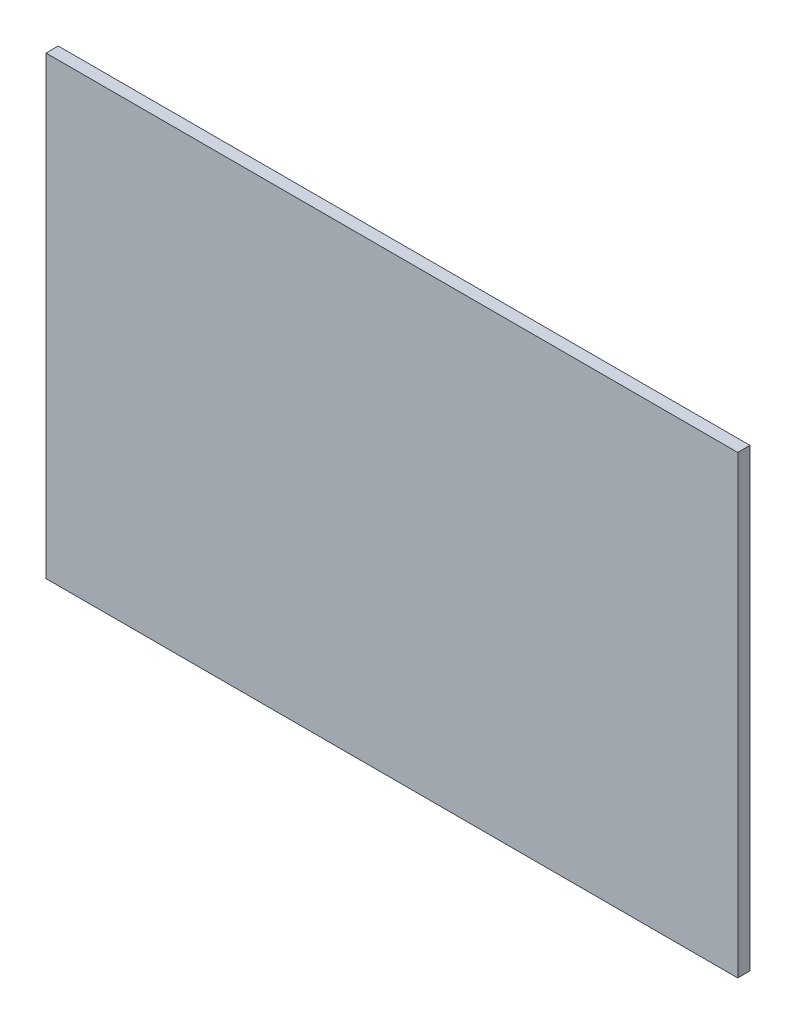
ISO-10303-21;
HEADER;
FILE_DESCRIPTION(('STEP AP214'),'2;1');
FILE_NAME('part.step','',(''),(''),'','','');
FILE_SCHEMA(('AUTOMOTIVE_DESIGN { 1 0 10303 214 1 1 1 1 }'));
ENDSEC;
DATA;
#1=APPLICATION_CONTEXT('core data for automotive mechanical design processes');
#2=APPLICATION_PROTOCOL_DEFINITION('international standard','automotive_design',2000,#1);
#3=PRODUCT_CONTEXT('',#1,'mechanical');
#4=PRODUCT('Part','Part','',(#3));
#5=PRODUCT_RELATED_PRODUCT_CATEGORY('part','',(#4));
#6=PRODUCT_DEFINITION_FORMATION('','',#4);
#7=PRODUCT_DEFINITION_CONTEXT('part definition',#1,'design');
#8=PRODUCT_DEFINITION('design','',#6,#7);
#9=PRODUCT_DEFINITION_SHAPE('','',#8);
#10=(LENGTH_UNIT() NAMED_UNIT(*) SI_UNIT(.MILLI.,.METRE.));
#11=(NAMED_UNIT(*) PLANE_ANGLE_UNIT() SI_UNIT($,.RADIAN.));
#12=(NAMED_UNIT(*) SI_UNIT($,.STERADIAN.) SOLID_ANGLE_UNIT());
#13=UNCERTAINTY_MEASURE_WITH_UNIT(LENGTH_MEASURE(1.E-05),#10,'distance_accuracy_value','');
#14=(GEOMETRIC_REPRESENTATION_CONTEXT(3) GLOBAL_UNCERTAINTY_ASSIGNED_CONTEXT((#13)) GLOBAL_UNIT_ASSIGNED_CONTEXT((#10,
#11,#12)) REPRESENTATION_CONTEXT('',''));
#15=CARTESIAN_POINT('',(0.,0.,0.));
#16=DIRECTION('',(0.,0.,1.));
#17=DIRECTION('',(1.,0.,0.));
#18=AXIS2_PLACEMENT_3D('',#15,#16,#17);
#19=CARTESIAN_POINT('',(-19.9999999999999,25.8895406963625,3.));
#20=DIRECTION('',(1.,0.,0.));
#21=DIRECTION('',(0.,1.,0.));
#22=AXIS2_PLACEMENT_3D('',#19,#20,#21);
#23=PLANE('',#22);
#24=DIRECTION('',(0.,-1.,0.));
#25=VECTOR('',#24,1.);
#26=CARTESIAN_POINT('',(-19.9999999999999,25.8895406963625,0.));
#27=LINE('',#26,#25);
#28=CARTESIAN_POINT('',(-19.9999999999999,25.8895406963625,0.));
#29=VERTEX_POINT('',#28);
#30=CARTESIAN_POINT('',(-19.9999999999999,-85.9787968324071,0.));
#31=VERTEX_POINT('',#30);
#32=EDGE_CURVE('E97',#29,#31,#27,.T.);
#33=ORIENTED_EDGE('',*,*,#32,.T.);
#34=DIRECTION('',(0.,0.,-1.));
#35=VECTOR('',#34,1.);
#36=CARTESIAN_POINT('',(-19.9999999999999,-85.9787968324071,3.));
#37=LINE('',#36,#35);
#38=CARTESIAN_POINT('',(-19.9999999999999,-85.9787968324071,3.));
#39=VERTEX_POINT('',#38);
#40=EDGE_CURVE('E11',#39,#31,#37,.T.);
#41=ORIENTED_EDGE('',*,*,#40,.F.);
#42=DIRECTION('',(0.,-1.,0.));
#43=VECTOR('',#42,1.);
#44=CARTESIAN_POINT('',(-19.9999999999999,25.8895406963625,3.));
#45=LINE('',#44,#43);
#46=CARTESIAN_POINT('',(-19.9999999999999,25.8895406963625,3.));
#47=VERTEX_POINT('',#46);
#48=EDGE_CURVE('E85',#47,#39,#45,.T.);
#49=ORIENTED_EDGE('',*,*,#48,.F.);
#50=DIRECTION('',(0.,0.,-1.));
#51=VECTOR('',#50,1.);
#52=CARTESIAN_POINT('',(-19.9999999999999,25.8895406963625,3.));
#53=LINE('',#52,#51);
#54=EDGE_CURVE('E93',#47,#29,#53,.T.);
#55=ORIENTED_EDGE('',*,*,#54,.T.);
#56=EDGE_LOOP('',(#33,#41,#49,#55));
#57=FACE_BOUND('',#56,.T.);
#58=ADVANCED_FACE('F34',(#57),#23,.F.);
#59=CARTESIAN_POINT('',(-19.9999999999999,-85.9787968324071,3.));
#60=DIRECTION('',(0.,1.,0.));
#61=DIRECTION('',(0.,0.,1.));
#62=AXIS2_PLACEMENT_3D('',#59,#60,#61);
#63=PLANE('',#62);
#64=DIRECTION('',(1.,0.,0.));
#65=VECTOR('',#64,1.);
#66=CARTESIAN_POINT('',(-19.9999999999999,-85.9787968324071,0.));
#67=LINE('',#66,#65);
#68=CARTESIAN_POINT('',(150.,-85.9787968324071,0.));
#69=VERTEX_POINT('',#68);
#70=EDGE_CURVE('E89',#31,#69,#67,.T.);
#71=ORIENTED_EDGE('',*,*,#70,.T.);
#72=DIRECTION('',(0.,0.,-1.));
#73=VECTOR('',#72,1.);
#74=CARTESIAN_POINT('',(150.,-85.9787968324071,3.));
#75=LINE('',#74,#73);
#76=CARTESIAN_POINT('',(150.,-85.9787968324071,3.));
#77=VERTEX_POINT('',#76);
#78=EDGE_CURVE('E42',#77,#69,#75,.T.);
#79=ORIENTED_EDGE('',*,*,#78,.F.);
#80=DIRECTION('',(1.,0.,0.));
#81=VECTOR('',#80,1.);
#82=CARTESIAN_POINT('',(-19.9999999999999,-85.9787968324071,3.));
#83=LINE('',#82,#81);
#84=EDGE_CURVE('E80',#39,#77,#83,.T.);
#85=ORIENTED_EDGE('',*,*,#84,.F.);
#86=ORIENTED_EDGE('',*,*,#40,.T.);
#87=EDGE_LOOP('',(#71,#79,#85,#86));
#88=FACE_BOUND('',#87,.T.);
#89=ADVANCED_FACE('F88',(#88),#63,.F.);
#90=CARTESIAN_POINT('',(150.,25.8895406963625,3.));
#91=DIRECTION('',(-1.,0.,0.));
#92=DIRECTION('',(0.,0.,1.));
#93=AXIS2_PLACEMENT_3D('',#90,#91,#92);
#94=PLANE('',#93);
#95=DIRECTION('',(0.,1.,0.));
#96=VECTOR('',#95,1.);
#97=CARTESIAN_POINT('',(150.,25.8895406963625,0.));
#98=LINE('',#97,#96);
#99=CARTESIAN_POINT('',(150.,25.8895406963625,0.));
#100=VERTEX_POINT('',#99);
#101=EDGE_CURVE('E67',#69,#100,#98,.T.);
#102=ORIENTED_EDGE('',*,*,#101,.T.);
#103=DIRECTION('',(0.,0.,-1.));
#104=VECTOR('',#103,1.);
#105=CARTESIAN_POINT('',(150.,25.8895406963625,3.));
#106=LINE('',#105,#104);
#107=CARTESIAN_POINT('',(150.,25.8895406963625,3.));
#108=VERTEX_POINT('',#107);
#109=EDGE_CURVE('E90',#108,#100,#106,.T.);
#110=ORIENTED_EDGE('',*,*,#109,.F.);
#111=DIRECTION('',(0.,1.,0.));
#112=VECTOR('',#111,1.);
#113=CARTESIAN_POINT('',(150.,25.8895406963625,3.));
#114=LINE('',#113,#112);
#115=EDGE_CURVE('E83',#77,#108,#114,.T.);
#116=ORIENTED_EDGE('',*,*,#115,.F.);
#117=ORIENTED_EDGE('',*,*,#78,.T.);
#118=EDGE_LOOP('',(#102,#110,#116,#117));
#119=FACE_BOUND('',#118,.T.);
#120=ADVANCED_FACE('F91',(#119),#94,.F.);
#121=CARTESIAN_POINT('',(-19.9999999999999,25.8895406963625,3.));
#122=DIRECTION('',(0.,-1.,0.));
#123=DIRECTION('',(0.,0.,-1.));
#124=AXIS2_PLACEMENT_3D('',#121,#122,#123);
#125=PLANE('',#124);
#126=DIRECTION('',(-1.,0.,0.));
#127=VECTOR('',#126,1.);
#128=CARTESIAN_POINT('',(-19.9999999999999,25.8895406963625,0.));
#129=LINE('',#128,#127);
#130=EDGE_CURVE('E73',#100,#29,#129,.T.);
#131=ORIENTED_EDGE('',*,*,#130,.T.);
#132=ORIENTED_EDGE('',*,*,#54,.F.);
#133=DIRECTION('',(-1.,0.,0.));
#134=VECTOR('',#133,1.);
#135=CARTESIAN_POINT('',(-19.9999999999999,25.8895406963625,3.));
#136=LINE('',#135,#134);
#137=EDGE_CURVE('E50',#108,#47,#136,.T.);
#138=ORIENTED_EDGE('',*,*,#137,.F.);
#139=ORIENTED_EDGE('',*,*,#109,.T.);
#140=EDGE_LOOP('',(#131,#132,#138,#139));
#141=FACE_BOUND('',#140,.T.);
#142=ADVANCED_FACE('F104',(#141),#125,.F.);
#143=CARTESIAN_POINT('',(0.,0.,3.));
#144=DIRECTION('',(0.,0.,1.));
#145=DIRECTION('',(1.,0.,0.));
#146=AXIS2_PLACEMENT_3D('',#143,#144,#145);
#147=PLANE('',#146);
#148=ORIENTED_EDGE('',*,*,#48,.T.);
#149=ORIENTED_EDGE('',*,*,#84,.T.);
#150=ORIENTED_EDGE('',*,*,#115,.T.);
#151=ORIENTED_EDGE('',*,*,#137,.T.);
#152=EDGE_LOOP('',(#148,#149,#150,#151));
#153=FACE_BOUND('',#152,.T.);
#154=ADVANCED_FACE('F81',(#153),#147,.T.);
#155=CARTESIAN_POINT('',(0.,0.,0.));
#156=DIRECTION('',(0.,0.,1.));
#157=DIRECTION('',(1.,0.,0.));
#158=AXIS2_PLACEMENT_3D('',#155,#156,#157);
#159=PLANE('',#158);
#160=ORIENTED_EDGE('',*,*,#32,.F.);
#161=ORIENTED_EDGE('',*,*,#130,.F.);
#162=ORIENTED_EDGE('',*,*,#101,.F.);
#163=ORIENTED_EDGE('',*,*,#70,.F.);
#164=EDGE_LOOP('',(#160,#161,#162,#163));
#165=FACE_BOUND('',#164,.T.);
#166=ADVANCED_FACE('F107',(#165),#159,.F.);
#167=CLOSED_SHELL('',(#58,#89,#120,#142,#154,#166));
#168=MANIFOLD_SOLID_BREP('B2',#167);
#169=ADVANCED_BREP_SHAPE_REPRESENTATION('',(#18,#168),#14);
#170=SHAPE_DEFINITION_REPRESENTATION(#9,#169);
ENDSEC;
END-ISO-10303-21;
